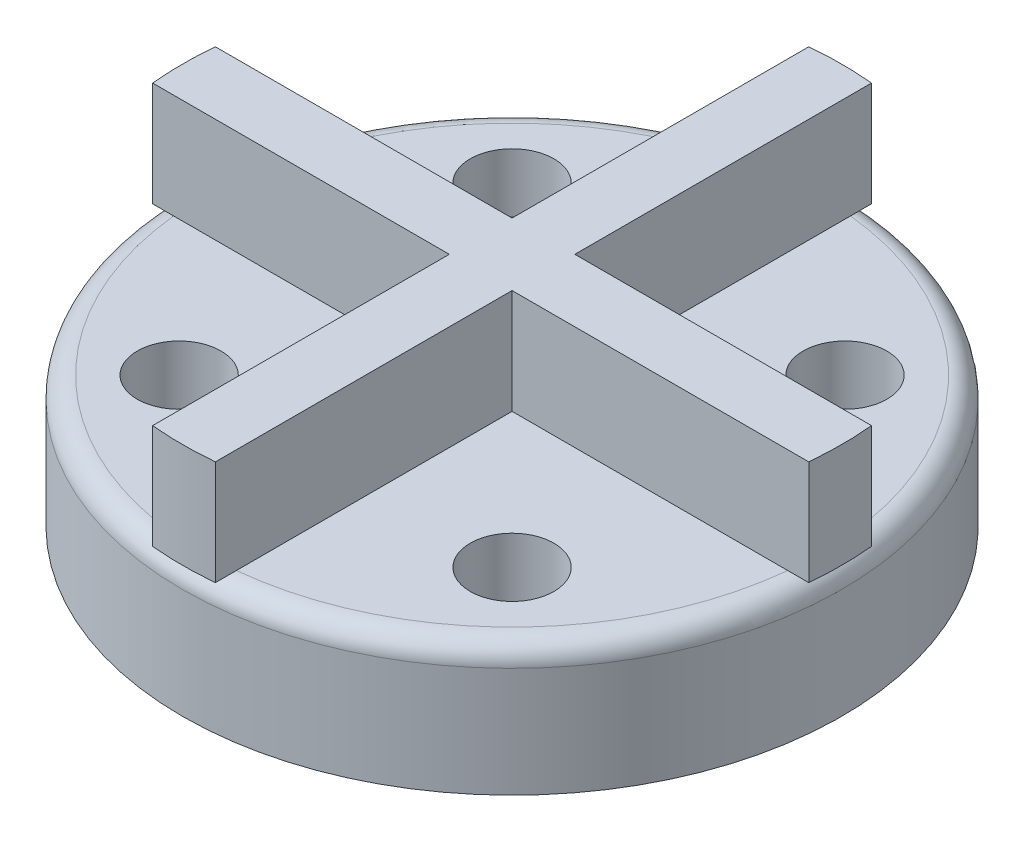
ISO-10303-21;
HEADER;
FILE_DESCRIPTION(('STEP AP214'),'2;1');
FILE_NAME('part.step','',(''),(''),'','','');
FILE_SCHEMA(('AUTOMOTIVE_DESIGN { 1 0 10303 214 1 1 1 1 }'));
ENDSEC;
DATA;
#1=APPLICATION_CONTEXT('core data for automotive mechanical design processes');
#2=APPLICATION_PROTOCOL_DEFINITION('international standard','automotive_design',2000,#1);
#3=PRODUCT_CONTEXT('',#1,'mechanical');
#4=PRODUCT('Part','Part','',(#3));
#5=PRODUCT_RELATED_PRODUCT_CATEGORY('part','',(#4));
#6=PRODUCT_DEFINITION_FORMATION('','',#4);
#7=PRODUCT_DEFINITION_CONTEXT('part definition',#1,'design');
#8=PRODUCT_DEFINITION('design','',#6,#7);
#9=PRODUCT_DEFINITION_SHAPE('','',#8);
#10=(LENGTH_UNIT() NAMED_UNIT(*) SI_UNIT(.MILLI.,.METRE.));
#11=(NAMED_UNIT(*) PLANE_ANGLE_UNIT() SI_UNIT($,.RADIAN.));
#12=(NAMED_UNIT(*) SI_UNIT($,.STERADIAN.) SOLID_ANGLE_UNIT());
#13=UNCERTAINTY_MEASURE_WITH_UNIT(LENGTH_MEASURE(1.E-05),#10,'distance_accuracy_value','');
#14=(GEOMETRIC_REPRESENTATION_CONTEXT(3) GLOBAL_UNCERTAINTY_ASSIGNED_CONTEXT((#13)) GLOBAL_UNIT_ASSIGNED_CONTEXT((#10,
#11,#12)) REPRESENTATION_CONTEXT('',''));
#15=CARTESIAN_POINT('',(0.,0.,0.));
#16=DIRECTION('',(0.,0.,1.));
#17=DIRECTION('',(1.,0.,0.));
#18=AXIS2_PLACEMENT_3D('',#15,#16,#17);
#19=CARTESIAN_POINT('',(0.,12.5,0.));
#20=DIRECTION('',(0.,1.,0.));
#21=DIRECTION('',(0.,0.,1.));
#22=AXIS2_PLACEMENT_3D('',#19,#20,#21);
#23=PLANE('',#22);
#24=CARTESIAN_POINT('',(15.9099025766973,12.5,-15.9099025766982));
#25=DIRECTION('',(0.,1.,0.));
#26=DIRECTION('',(0.,0.,1.));
#27=AXIS2_PLACEMENT_3D('',#24,#25,#26);
#28=CIRCLE('',#27,4.00000000000094);
#29=CARTESIAN_POINT('',(15.9099025766973,12.5,-11.9099025766973));
#30=VERTEX_POINT('',#29);
#31=EDGE_CURVE('E196',#30,#30,#28,.T.);
#32=ORIENTED_EDGE('',*,*,#31,.F.);
#33=EDGE_LOOP('',(#32));
#34=FACE_BOUND('',#33,.T.);
#35=DIRECTION('',(0.,0.,-1.));
#36=VECTOR('',#35,1.);
#37=CARTESIAN_POINT('',(3.00000000000011,12.5,-31.3568174405503));
#38=LINE('',#37,#36);
#39=CARTESIAN_POINT('',(3.00000000000005,12.5,-3.));
#40=VERTEX_POINT('',#39);
#41=CARTESIAN_POINT('',(3.00000000000011,12.5,-29.3470611816584));
#42=VERTEX_POINT('',#41);
#43=EDGE_CURVE('E52',#40,#42,#38,.T.);
#44=ORIENTED_EDGE('',*,*,#43,.F.);
#45=DIRECTION('',(-1.,0.,0.));
#46=VECTOR('',#45,1.);
#47=CARTESIAN_POINT('',(3.00000000000005,12.5,-3.));
#48=LINE('',#47,#46);
#49=CARTESIAN_POINT('',(29.3470611816584,12.5,-3.));
#50=VERTEX_POINT('',#49);
#51=EDGE_CURVE('E241',#50,#40,#48,.T.);
#52=ORIENTED_EDGE('',*,*,#51,.F.);
#53=CARTESIAN_POINT('',(0.,12.5,0.));
#54=DIRECTION('',(0.,1.,0.));
#55=DIRECTION('',(0.,0.,1.));
#56=AXIS2_PLACEMENT_3D('',#53,#54,#55);
#57=CIRCLE('',#56,29.5);
#58=EDGE_CURVE('E216',#50,#42,#57,.T.);
#59=ORIENTED_EDGE('',*,*,#58,.T.);
#60=EDGE_LOOP('',(#44,#52,#59));
#61=FACE_BOUND('',#60,.T.);
#62=ADVANCED_FACE('F37',(#34,#61),#23,.T.);
#63=CARTESIAN_POINT('',(-15.9099025766973,12.5,-15.9099025766973));
#64=DIRECTION('',(0.,1.,0.));
#65=DIRECTION('',(0.,0.,1.));
#66=AXIS2_PLACEMENT_3D('',#63,#64,#65);
#67=CIRCLE('',#66,4.00000000000001);
#68=CARTESIAN_POINT('',(-15.9099025766973,12.5,-11.9099025766973));
#69=VERTEX_POINT('',#68);
#70=EDGE_CURVE('E202',#69,#69,#67,.T.);
#71=ORIENTED_EDGE('',*,*,#70,.F.);
#72=EDGE_LOOP('',(#71));
#73=FACE_BOUND('',#72,.T.);
#74=DIRECTION('',(-1.,0.,0.));
#75=VECTOR('',#74,1.);
#76=CARTESIAN_POINT('',(-31.3568174405503,12.5,-3.));
#77=LINE('',#76,#75);
#78=CARTESIAN_POINT('',(-2.99999999999995,12.5,-3.));
#79=VERTEX_POINT('',#78);
#80=CARTESIAN_POINT('',(-29.3470611816584,12.5,-3.));
#81=VERTEX_POINT('',#80);
#82=EDGE_CURVE('E60',#79,#81,#77,.T.);
#83=ORIENTED_EDGE('',*,*,#82,.F.);
#84=DIRECTION('',(0.,0.,1.));
#85=VECTOR('',#84,1.);
#86=CARTESIAN_POINT('',(-2.99999999999989,12.5,-31.3568174405503));
#87=LINE('',#86,#85);
#88=CARTESIAN_POINT('',(-2.99999999999989,12.5,-29.3470611816584));
#89=VERTEX_POINT('',#88);
#90=EDGE_CURVE('E253',#89,#79,#87,.T.);
#91=ORIENTED_EDGE('',*,*,#90,.F.);
#92=EDGE_CURVE('E228',#89,#81,#57,.T.);
#93=ORIENTED_EDGE('',*,*,#92,.T.);
#94=EDGE_LOOP('',(#83,#91,#93));
#95=FACE_BOUND('',#94,.T.);
#96=ADVANCED_FACE('F348',(#73,#95),#23,.T.);
#97=CARTESIAN_POINT('',(-15.9099025766964,12.5,15.9099025766973));
#98=DIRECTION('',(0.,1.,0.));
#99=DIRECTION('',(0.,0.,1.));
#100=AXIS2_PLACEMENT_3D('',#97,#98,#99);
#101=CIRCLE('',#100,4.00000000000049);
#102=CARTESIAN_POINT('',(-15.9099025766964,12.5,19.9099025766978));
#103=VERTEX_POINT('',#102);
#104=EDGE_CURVE('E181',#103,#103,#101,.T.);
#105=ORIENTED_EDGE('',*,*,#104,.F.);
#106=EDGE_LOOP('',(#105));
#107=FACE_BOUND('',#106,.T.);
#108=DIRECTION('',(0.,0.,1.));
#109=VECTOR('',#108,1.);
#110=CARTESIAN_POINT('',(-3.00000000000006,12.5,3.));
#111=LINE('',#110,#109);
#112=CARTESIAN_POINT('',(-3.00000000000006,12.5,3.));
#113=VERTEX_POINT('',#112);
#114=CARTESIAN_POINT('',(-3.00000000000053,12.5,29.3470611816583));
#115=VERTEX_POINT('',#114);
#116=EDGE_CURVE('E268',#113,#115,#111,.T.);
#117=ORIENTED_EDGE('',*,*,#116,.F.);
#118=DIRECTION('',(1.,0.,0.));
#119=VECTOR('',#118,1.);
#120=CARTESIAN_POINT('',(-31.3568174405503,12.5,3.));
#121=LINE('',#120,#119);
#122=CARTESIAN_POINT('',(-29.3470611816584,12.5,3.));
#123=VERTEX_POINT('',#122);
#124=EDGE_CURVE('E264',#123,#113,#121,.T.);
#125=ORIENTED_EDGE('',*,*,#124,.F.);
#126=EDGE_CURVE('E218',#123,#115,#57,.T.);
#127=ORIENTED_EDGE('',*,*,#126,.T.);
#128=EDGE_LOOP('',(#117,#125,#127));
#129=FACE_BOUND('',#128,.T.);
#130=ADVANCED_FACE('F354',(#107,#129),#23,.T.);
#131=CARTESIAN_POINT('',(15.9099025766982,12.5,15.9099025766964));
#132=DIRECTION('',(0.,1.,0.));
#133=DIRECTION('',(0.,0.,1.));
#134=AXIS2_PLACEMENT_3D('',#131,#132,#133);
#135=CIRCLE('',#134,4.00000000000129);
#136=CARTESIAN_POINT('',(15.9099025766982,12.5,19.9099025766977));
#137=VERTEX_POINT('',#136);
#138=EDGE_CURVE('E190',#137,#137,#135,.T.);
#139=ORIENTED_EDGE('',*,*,#138,.F.);
#140=EDGE_LOOP('',(#139));
#141=FACE_BOUND('',#140,.T.);
#142=DIRECTION('',(1.,0.,0.));
#143=VECTOR('',#142,1.);
#144=CARTESIAN_POINT('',(2.99999999999999,12.5,3.));
#145=LINE('',#144,#143);
#146=CARTESIAN_POINT('',(2.99999999999999,12.5,3.));
#147=VERTEX_POINT('',#146);
#148=CARTESIAN_POINT('',(29.3470611816584,12.5,3.));
#149=VERTEX_POINT('',#148);
#150=EDGE_CURVE('E173',#147,#149,#145,.T.);
#151=ORIENTED_EDGE('',*,*,#150,.F.);
#152=DIRECTION('',(0.,0.,-1.));
#153=VECTOR('',#152,1.);
#154=CARTESIAN_POINT('',(2.99999999999999,12.5,3.));
#155=LINE('',#154,#153);
#156=CARTESIAN_POINT('',(2.9999999999999,12.5,29.3470611816584));
#157=VERTEX_POINT('',#156);
#158=EDGE_CURVE('E273',#157,#147,#155,.T.);
#159=ORIENTED_EDGE('',*,*,#158,.F.);
#160=EDGE_CURVE('E45',#157,#149,#57,.T.);
#161=ORIENTED_EDGE('',*,*,#160,.T.);
#162=EDGE_LOOP('',(#151,#159,#161));
#163=FACE_BOUND('',#162,.T.);
#164=ADVANCED_FACE('F329',(#141,#163),#23,.T.);
#165=CARTESIAN_POINT('',(0.,0.,0.));
#166=DIRECTION('',(0.,1.,0.));
#167=DIRECTION('',(0.,0.,1.));
#168=AXIS2_PLACEMENT_3D('',#165,#166,#167);
#169=PLANE('',#168);
#170=CARTESIAN_POINT('',(0.,0.,0.));
#171=DIRECTION('',(0.,1.,0.));
#172=DIRECTION('',(0.,0.,1.));
#173=AXIS2_PLACEMENT_3D('',#170,#171,#172);
#174=CIRCLE('',#173,31.5);
#175=CARTESIAN_POINT('',(0.,0.,31.5));
#176=VERTEX_POINT('',#175);
#177=EDGE_CURVE('E205',#176,#176,#174,.T.);
#178=ORIENTED_EDGE('',*,*,#177,.F.);
#179=EDGE_LOOP('',(#178));
#180=FACE_BOUND('',#179,.T.);
#181=CARTESIAN_POINT('',(-15.9099025766973,0.,-15.9099025766973));
#182=DIRECTION('',(0.,1.,0.));
#183=DIRECTION('',(0.,0.,1.));
#184=AXIS2_PLACEMENT_3D('',#181,#182,#183);
#185=CIRCLE('',#184,4.00000000000001);
#186=CARTESIAN_POINT('',(-15.9099025766973,0.,-11.9099025766973));
#187=VERTEX_POINT('',#186);
#188=EDGE_CURVE('E199',#187,#187,#185,.T.);
#189=ORIENTED_EDGE('',*,*,#188,.T.);
#190=EDGE_LOOP('',(#189));
#191=FACE_BOUND('',#190,.T.);
#192=CARTESIAN_POINT('',(15.9099025766973,0.,-15.9099025766982));
#193=DIRECTION('',(0.,1.,0.));
#194=DIRECTION('',(0.,0.,1.));
#195=AXIS2_PLACEMENT_3D('',#192,#193,#194);
#196=CIRCLE('',#195,4.00000000000094);
#197=CARTESIAN_POINT('',(15.9099025766973,0.,-11.9099025766973));
#198=VERTEX_POINT('',#197);
#199=EDGE_CURVE('E193',#198,#198,#196,.T.);
#200=ORIENTED_EDGE('',*,*,#199,.T.);
#201=EDGE_LOOP('',(#200));
#202=FACE_BOUND('',#201,.T.);
#203=CARTESIAN_POINT('',(15.9099025766982,0.,15.9099025766964));
#204=DIRECTION('',(0.,1.,0.));
#205=DIRECTION('',(0.,0.,1.));
#206=AXIS2_PLACEMENT_3D('',#203,#204,#205);
#207=CIRCLE('',#206,4.00000000000129);
#208=CARTESIAN_POINT('',(15.9099025766982,0.,19.9099025766977));
#209=VERTEX_POINT('',#208);
#210=EDGE_CURVE('E188',#209,#209,#207,.T.);
#211=ORIENTED_EDGE('',*,*,#210,.T.);
#212=EDGE_LOOP('',(#211));
#213=FACE_BOUND('',#212,.T.);
#214=CARTESIAN_POINT('',(-15.9099025766964,0.,15.9099025766973));
#215=DIRECTION('',(0.,1.,0.));
#216=DIRECTION('',(0.,0.,1.));
#217=AXIS2_PLACEMENT_3D('',#214,#215,#216);
#218=CIRCLE('',#217,4.00000000000049);
#219=CARTESIAN_POINT('',(-15.9099025766964,0.,19.9099025766978));
#220=VERTEX_POINT('',#219);
#221=EDGE_CURVE('E178',#220,#220,#218,.T.);
#222=ORIENTED_EDGE('',*,*,#221,.T.);
#223=EDGE_LOOP('',(#222));
#224=FACE_BOUND('',#223,.T.);
#225=ADVANCED_FACE('F360',(#180,#191,#202,#213,#224),#169,.F.);
#226=CARTESIAN_POINT('',(0.,12.5,0.));
#227=DIRECTION('',(0.,-1.,0.));
#228=DIRECTION('',(0.,0.,-1.));
#229=AXIS2_PLACEMENT_3D('',#226,#227,#228);
#230=CYLINDRICAL_SURFACE('',#229,31.5);
#231=CARTESIAN_POINT('',(0.,10.5,0.));
#232=DIRECTION('',(0.,1.,0.));
#233=DIRECTION('',(0.,0.,1.));
#234=AXIS2_PLACEMENT_3D('',#231,#232,#233);
#235=CIRCLE('',#234,31.5);
#236=CARTESIAN_POINT('',(0.,10.5,31.5));
#237=VERTEX_POINT('',#236);
#238=EDGE_CURVE('E11',#237,#237,#235,.F.);
#239=ORIENTED_EDGE('',*,*,#238,.T.);
#240=EDGE_LOOP('',(#239));
#241=FACE_BOUND('',#240,.T.);
#242=ORIENTED_EDGE('',*,*,#177,.T.);
#243=EDGE_LOOP('',(#242));
#244=FACE_BOUND('',#243,.T.);
#245=ADVANCED_FACE('F366',(#241,#244),#230,.T.);
#246=CARTESIAN_POINT('',(-15.9099025766973,12.5,-15.9099025766973));
#247=DIRECTION('',(0.,-1.,0.));
#248=DIRECTION('',(0.,0.,-1.));
#249=AXIS2_PLACEMENT_3D('',#246,#247,#248);
#250=CYLINDRICAL_SURFACE('',#249,4.00000000000001);
#251=ORIENTED_EDGE('',*,*,#70,.T.);
#252=EDGE_LOOP('',(#251));
#253=FACE_BOUND('',#252,.T.);
#254=ORIENTED_EDGE('',*,*,#188,.F.);
#255=EDGE_LOOP('',(#254));
#256=FACE_BOUND('',#255,.T.);
#257=ADVANCED_FACE('F394',(#253,#256),#250,.F.);
#258=CARTESIAN_POINT('',(15.9099025766973,12.5,-15.9099025766982));
#259=DIRECTION('',(0.,-1.,0.));
#260=DIRECTION('',(0.,0.,-1.));
#261=AXIS2_PLACEMENT_3D('',#258,#259,#260);
#262=CYLINDRICAL_SURFACE('',#261,4.00000000000094);
#263=ORIENTED_EDGE('',*,*,#31,.T.);
#264=EDGE_LOOP('',(#263));
#265=FACE_BOUND('',#264,.T.);
#266=ORIENTED_EDGE('',*,*,#199,.F.);
#267=EDGE_LOOP('',(#266));
#268=FACE_BOUND('',#267,.T.);
#269=ADVANCED_FACE('F375',(#265,#268),#262,.F.);
#270=CARTESIAN_POINT('',(15.9099025766982,12.5,15.9099025766964));
#271=DIRECTION('',(0.,-1.,0.));
#272=DIRECTION('',(0.,0.,-1.));
#273=AXIS2_PLACEMENT_3D('',#270,#271,#272);
#274=CYLINDRICAL_SURFACE('',#273,4.00000000000129);
#275=ORIENTED_EDGE('',*,*,#138,.T.);
#276=EDGE_LOOP('',(#275));
#277=FACE_BOUND('',#276,.T.);
#278=ORIENTED_EDGE('',*,*,#210,.F.);
#279=EDGE_LOOP('',(#278));
#280=FACE_BOUND('',#279,.T.);
#281=ADVANCED_FACE('F371',(#277,#280),#274,.F.);
#282=CARTESIAN_POINT('',(-15.9099025766964,12.5,15.9099025766973));
#283=DIRECTION('',(0.,-1.,0.));
#284=DIRECTION('',(0.,0.,-1.));
#285=AXIS2_PLACEMENT_3D('',#282,#283,#284);
#286=CYLINDRICAL_SURFACE('',#285,4.00000000000049);
#287=ORIENTED_EDGE('',*,*,#104,.T.);
#288=EDGE_LOOP('',(#287));
#289=FACE_BOUND('',#288,.T.);
#290=ORIENTED_EDGE('',*,*,#221,.F.);
#291=EDGE_LOOP('',(#290));
#292=FACE_BOUND('',#291,.T.);
#293=ADVANCED_FACE('F374',(#289,#292),#286,.F.);
#294=CARTESIAN_POINT('',(0.,10.5,0.));
#295=DIRECTION('',(0.,1.,0.));
#296=DIRECTION('',(0.,0.,1.));
#297=AXIS2_PLACEMENT_3D('',#294,#295,#296);
#298=TOROIDAL_SURFACE('',#297,29.5,2.);
#299=ORIENTED_EDGE('',*,*,#238,.F.);
#300=EDGE_LOOP('',(#299));
#301=FACE_BOUND('',#300,.T.);
#302=ORIENTED_EDGE('',*,*,#160,.F.);
#303=EDGE_CURVE('E209',#115,#157,#57,.T.);
#304=ORIENTED_EDGE('',*,*,#303,.F.);
#305=ORIENTED_EDGE('',*,*,#126,.F.);
#306=EDGE_CURVE('E224',#81,#123,#57,.T.);
#307=ORIENTED_EDGE('',*,*,#306,.F.);
#308=ORIENTED_EDGE('',*,*,#92,.F.);
#309=EDGE_CURVE('E233',#42,#89,#57,.T.);
#310=ORIENTED_EDGE('',*,*,#309,.F.);
#311=ORIENTED_EDGE('',*,*,#58,.F.);
#312=EDGE_CURVE('E211',#149,#50,#57,.T.);
#313=ORIENTED_EDGE('',*,*,#312,.F.);
#314=EDGE_LOOP('',(#302,#304,#305,#307,#308,#310,#311,#313));
#315=FACE_BOUND('',#314,.T.);
#316=ADVANCED_FACE('F39',(#301,#315),#298,.T.);
#317=CARTESIAN_POINT('',(0.,12.5,0.));
#318=DIRECTION('',(0.,1.,0.));
#319=DIRECTION('',(0.,0.,1.));
#320=AXIS2_PLACEMENT_3D('',#317,#318,#319);
#321=PLANE('',#320);
#322=ORIENTED_EDGE('',*,*,#306,.T.);
#323=CARTESIAN_POINT('',(-31.3568174405503,12.5,2.99999999999998));
#324=VERTEX_POINT('',#323);
#325=EDGE_CURVE('E265',#324,#123,#121,.T.);
#326=ORIENTED_EDGE('',*,*,#325,.F.);
#327=CARTESIAN_POINT('',(0.,12.5,0.));
#328=DIRECTION('',(0.,1.,0.));
#329=DIRECTION('',(0.,0.,1.));
#330=AXIS2_PLACEMENT_3D('',#327,#328,#329);
#331=CIRCLE('',#330,31.5);
#332=CARTESIAN_POINT('',(-31.3568174405503,12.5,-3.));
#333=VERTEX_POINT('',#332);
#334=EDGE_CURVE('E262',#333,#324,#331,.T.);
#335=ORIENTED_EDGE('',*,*,#334,.F.);
#336=EDGE_CURVE('E260',#81,#333,#77,.T.);
#337=ORIENTED_EDGE('',*,*,#336,.F.);
#338=EDGE_LOOP('',(#322,#326,#335,#337));
#339=FACE_BOUND('',#338,.T.);
#340=ADVANCED_FACE('F388',(#339),#321,.F.);
#341=ORIENTED_EDGE('',*,*,#309,.T.);
#342=CARTESIAN_POINT('',(-2.99999999999988,12.5,-31.3568174405503));
#343=VERTEX_POINT('',#342);
#344=EDGE_CURVE('E258',#343,#89,#87,.T.);
#345=ORIENTED_EDGE('',*,*,#344,.F.);
#346=CARTESIAN_POINT('',(0.,12.5,0.));
#347=DIRECTION('',(0.,1.,0.));
#348=DIRECTION('',(0.,0.,1.));
#349=AXIS2_PLACEMENT_3D('',#346,#347,#348);
#350=CIRCLE('',#349,31.5);
#351=CARTESIAN_POINT('',(3.00000000000011,12.5,-31.3568174405503));
#352=VERTEX_POINT('',#351);
#353=EDGE_CURVE('E246',#352,#343,#350,.T.);
#354=ORIENTED_EDGE('',*,*,#353,.F.);
#355=EDGE_CURVE('E244',#42,#352,#38,.T.);
#356=ORIENTED_EDGE('',*,*,#355,.F.);
#357=EDGE_LOOP('',(#341,#345,#354,#356));
#358=FACE_BOUND('',#357,.T.);
#359=ADVANCED_FACE('F245',(#358),#321,.F.);
#360=ORIENTED_EDGE('',*,*,#312,.T.);
#361=CARTESIAN_POINT('',(31.3568174405503,12.5,-3.));
#362=VERTEX_POINT('',#361);
#363=EDGE_CURVE('E250',#362,#50,#48,.T.);
#364=ORIENTED_EDGE('',*,*,#363,.F.);
#365=CARTESIAN_POINT('',(0.,12.5,0.));
#366=DIRECTION('',(0.,1.,0.));
#367=DIRECTION('',(0.,0.,1.));
#368=AXIS2_PLACEMENT_3D('',#365,#366,#367);
#369=CIRCLE('',#368,31.5);
#370=CARTESIAN_POINT('',(31.3568174405503,12.5,3.));
#371=VERTEX_POINT('',#370);
#372=EDGE_CURVE('E177',#371,#362,#369,.T.);
#373=ORIENTED_EDGE('',*,*,#372,.F.);
#374=EDGE_CURVE('E276',#149,#371,#145,.T.);
#375=ORIENTED_EDGE('',*,*,#374,.F.);
#376=EDGE_LOOP('',(#360,#364,#373,#375));
#377=FACE_BOUND('',#376,.T.);
#378=ADVANCED_FACE('F327',(#377),#321,.F.);
#379=CARTESIAN_POINT('',(0.,22.5,0.));
#380=DIRECTION('',(0.,-1.,0.));
#381=DIRECTION('',(0.,0.,-1.));
#382=AXIS2_PLACEMENT_3D('',#379,#380,#381);
#383=CYLINDRICAL_SURFACE('',#382,31.5);
#384=ORIENTED_EDGE('',*,*,#372,.T.);
#385=DIRECTION('',(0.,-1.,0.));
#386=VECTOR('',#385,1.);
#387=CARTESIAN_POINT('',(31.3568174405503,22.5,-3.));
#388=LINE('',#387,#386);
#389=CARTESIAN_POINT('',(31.3568174405503,22.5,-3.));
#390=VERTEX_POINT('',#389);
#391=EDGE_CURVE('E157',#390,#362,#388,.T.);
#392=ORIENTED_EDGE('',*,*,#391,.F.);
#393=CARTESIAN_POINT('',(0.,22.5,0.));
#394=DIRECTION('',(0.,1.,0.));
#395=DIRECTION('',(0.,0.,1.));
#396=AXIS2_PLACEMENT_3D('',#393,#394,#395);
#397=CIRCLE('',#396,31.5);
#398=CARTESIAN_POINT('',(31.3568174405503,22.5,3.));
#399=VERTEX_POINT('',#398);
#400=EDGE_CURVE('E164',#399,#390,#397,.T.);
#401=ORIENTED_EDGE('',*,*,#400,.F.);
#402=DIRECTION('',(0.,-1.,0.));
#403=VECTOR('',#402,1.);
#404=CARTESIAN_POINT('',(31.3568174405503,22.5,3.));
#405=LINE('',#404,#403);
#406=EDGE_CURVE('E279',#399,#371,#405,.T.);
#407=ORIENTED_EDGE('',*,*,#406,.T.);
#408=EDGE_LOOP('',(#384,#392,#401,#407));
#409=FACE_BOUND('',#408,.T.);
#410=ADVANCED_FACE('F175',(#409),#383,.T.);
#411=CARTESIAN_POINT('',(3.00000000000005,22.5,-3.));
#412=DIRECTION('',(0.,0.,1.));
#413=DIRECTION('',(1.,0.,0.));
#414=AXIS2_PLACEMENT_3D('',#411,#412,#413);
#415=PLANE('',#414);
#416=ORIENTED_EDGE('',*,*,#363,.T.);
#417=ORIENTED_EDGE('',*,*,#51,.T.);
#418=DIRECTION('',(0.,-1.,0.));
#419=VECTOR('',#418,1.);
#420=CARTESIAN_POINT('',(3.00000000000005,22.5,-3.));
#421=LINE('',#420,#419);
#422=CARTESIAN_POINT('',(3.00000000000005,22.5,-3.));
#423=VERTEX_POINT('',#422);
#424=EDGE_CURVE('E160',#423,#40,#421,.T.);
#425=ORIENTED_EDGE('',*,*,#424,.F.);
#426=DIRECTION('',(-1.,0.,0.));
#427=VECTOR('',#426,1.);
#428=CARTESIAN_POINT('',(3.00000000000005,22.5,-3.));
#429=LINE('',#428,#427);
#430=EDGE_CURVE('E152',#390,#423,#429,.T.);
#431=ORIENTED_EDGE('',*,*,#430,.F.);
#432=ORIENTED_EDGE('',*,*,#391,.T.);
#433=EDGE_LOOP('',(#416,#417,#425,#431,#432));
#434=FACE_BOUND('',#433,.T.);
#435=ADVANCED_FACE('F155',(#434),#415,.F.);
#436=CARTESIAN_POINT('',(3.00000000000011,22.5,-31.3568174405503));
#437=DIRECTION('',(-1.,0.,0.));
#438=DIRECTION('',(0.,0.,1.));
#439=AXIS2_PLACEMENT_3D('',#436,#437,#438);
#440=PLANE('',#439);
#441=ORIENTED_EDGE('',*,*,#43,.T.);
#442=ORIENTED_EDGE('',*,*,#355,.T.);
#443=DIRECTION('',(0.,-1.,0.));
#444=VECTOR('',#443,1.);
#445=CARTESIAN_POINT('',(3.00000000000011,22.5,-31.3568174405503));
#446=LINE('',#445,#444);
#447=CARTESIAN_POINT('',(3.00000000000011,22.5,-31.3568174405503));
#448=VERTEX_POINT('',#447);
#449=EDGE_CURVE('E183',#448,#352,#446,.T.);
#450=ORIENTED_EDGE('',*,*,#449,.F.);
#451=DIRECTION('',(0.,0.,-1.));
#452=VECTOR('',#451,1.);
#453=CARTESIAN_POINT('',(3.00000000000011,22.5,-31.3568174405503));
#454=LINE('',#453,#452);
#455=EDGE_CURVE('E163',#423,#448,#454,.T.);
#456=ORIENTED_EDGE('',*,*,#455,.F.);
#457=ORIENTED_EDGE('',*,*,#424,.T.);
#458=EDGE_LOOP('',(#441,#442,#450,#456,#457));
#459=FACE_BOUND('',#458,.T.);
#460=ADVANCED_FACE('F252',(#459),#440,.F.);
#461=CARTESIAN_POINT('',(0.,22.5,0.));
#462=DIRECTION('',(0.,-1.,0.));
#463=DIRECTION('',(0.,0.,-1.));
#464=AXIS2_PLACEMENT_3D('',#461,#462,#463);
#465=CYLINDRICAL_SURFACE('',#464,31.5);
#466=ORIENTED_EDGE('',*,*,#353,.T.);
#467=DIRECTION('',(0.,-1.,0.));
#468=VECTOR('',#467,1.);
#469=CARTESIAN_POINT('',(-2.99999999999988,22.5,-31.3568174405503));
#470=LINE('',#469,#468);
#471=CARTESIAN_POINT('',(-2.99999999999988,22.5,-31.3568174405503));
#472=VERTEX_POINT('',#471);
#473=EDGE_CURVE('E302',#472,#343,#470,.T.);
#474=ORIENTED_EDGE('',*,*,#473,.F.);
#475=CARTESIAN_POINT('',(0.,22.5,0.));
#476=DIRECTION('',(0.,1.,0.));
#477=DIRECTION('',(0.,0.,1.));
#478=AXIS2_PLACEMENT_3D('',#475,#476,#477);
#479=CIRCLE('',#478,31.5);
#480=EDGE_CURVE('E308',#448,#472,#479,.T.);
#481=ORIENTED_EDGE('',*,*,#480,.F.);
#482=ORIENTED_EDGE('',*,*,#449,.T.);
#483=EDGE_LOOP('',(#466,#474,#481,#482));
#484=FACE_BOUND('',#483,.T.);
#485=ADVANCED_FACE('F306',(#484),#465,.T.);
#486=CARTESIAN_POINT('',(-2.99999999999989,22.5,-31.3568174405503));
#487=DIRECTION('',(1.,0.,0.));
#488=DIRECTION('',(0.,0.,-1.));
#489=AXIS2_PLACEMENT_3D('',#486,#487,#488);
#490=PLANE('',#489);
#491=ORIENTED_EDGE('',*,*,#344,.T.);
#492=ORIENTED_EDGE('',*,*,#90,.T.);
#493=DIRECTION('',(0.,-1.,0.));
#494=VECTOR('',#493,1.);
#495=CARTESIAN_POINT('',(-2.99999999999995,22.5,-3.));
#496=LINE('',#495,#494);
#497=CARTESIAN_POINT('',(-2.99999999999995,22.5,-3.));
#498=VERTEX_POINT('',#497);
#499=EDGE_CURVE('E299',#498,#79,#496,.T.);
#500=ORIENTED_EDGE('',*,*,#499,.F.);
#501=DIRECTION('',(0.,0.,1.));
#502=VECTOR('',#501,1.);
#503=CARTESIAN_POINT('',(-2.99999999999989,22.5,-31.3568174405503));
#504=LINE('',#503,#502);
#505=EDGE_CURVE('E310',#472,#498,#504,.T.);
#506=ORIENTED_EDGE('',*,*,#505,.F.);
#507=ORIENTED_EDGE('',*,*,#473,.T.);
#508=EDGE_LOOP('',(#491,#492,#500,#506,#507));
#509=FACE_BOUND('',#508,.T.);
#510=ADVANCED_FACE('F508',(#509),#490,.F.);
#511=CARTESIAN_POINT('',(-31.3568174405503,22.5,-3.));
#512=DIRECTION('',(0.,0.,1.));
#513=DIRECTION('',(1.,0.,0.));
#514=AXIS2_PLACEMENT_3D('',#511,#512,#513);
#515=PLANE('',#514);
#516=ORIENTED_EDGE('',*,*,#82,.T.);
#517=ORIENTED_EDGE('',*,*,#336,.T.);
#518=DIRECTION('',(0.,-1.,0.));
#519=VECTOR('',#518,1.);
#520=CARTESIAN_POINT('',(-31.3568174405503,22.5,-3.));
#521=LINE('',#520,#519);
#522=CARTESIAN_POINT('',(-31.3568174405503,22.5,-3.));
#523=VERTEX_POINT('',#522);
#524=EDGE_CURVE('E296',#523,#333,#521,.T.);
#525=ORIENTED_EDGE('',*,*,#524,.F.);
#526=DIRECTION('',(-1.,0.,0.));
#527=VECTOR('',#526,1.);
#528=CARTESIAN_POINT('',(-31.3568174405503,22.5,-3.));
#529=LINE('',#528,#527);
#530=EDGE_CURVE('E314',#498,#523,#529,.T.);
#531=ORIENTED_EDGE('',*,*,#530,.F.);
#532=ORIENTED_EDGE('',*,*,#499,.T.);
#533=EDGE_LOOP('',(#516,#517,#525,#531,#532));
#534=FACE_BOUND('',#533,.T.);
#535=ADVANCED_FACE('F516',(#534),#515,.F.);
#536=CARTESIAN_POINT('',(0.,22.5,0.));
#537=DIRECTION('',(0.,-1.,0.));
#538=DIRECTION('',(0.,0.,-1.));
#539=AXIS2_PLACEMENT_3D('',#536,#537,#538);
#540=CYLINDRICAL_SURFACE('',#539,31.5);
#541=ORIENTED_EDGE('',*,*,#334,.T.);
#542=DIRECTION('',(0.,-1.,0.));
#543=VECTOR('',#542,1.);
#544=CARTESIAN_POINT('',(-31.3568174405503,22.5,2.99999999999998));
#545=LINE('',#544,#543);
#546=CARTESIAN_POINT('',(-31.3568174405503,22.5,2.99999999999998));
#547=VERTEX_POINT('',#546);
#548=EDGE_CURVE('E293',#547,#324,#545,.T.);
#549=ORIENTED_EDGE('',*,*,#548,.F.);
#550=CARTESIAN_POINT('',(0.,22.5,0.));
#551=DIRECTION('',(0.,1.,0.));
#552=DIRECTION('',(0.,0.,1.));
#553=AXIS2_PLACEMENT_3D('',#550,#551,#552);
#554=CIRCLE('',#553,31.5);
#555=EDGE_CURVE('E316',#523,#547,#554,.T.);
#556=ORIENTED_EDGE('',*,*,#555,.F.);
#557=ORIENTED_EDGE('',*,*,#524,.T.);
#558=EDGE_LOOP('',(#541,#549,#556,#557));
#559=FACE_BOUND('',#558,.T.);
#560=ADVANCED_FACE('F525',(#559),#540,.T.);
#561=CARTESIAN_POINT('',(-31.3568174405503,22.5,3.));
#562=DIRECTION('',(0.,0.,-1.));
#563=DIRECTION('',(-1.,0.,0.));
#564=AXIS2_PLACEMENT_3D('',#561,#562,#563);
#565=PLANE('',#564);
#566=ORIENTED_EDGE('',*,*,#325,.T.);
#567=ORIENTED_EDGE('',*,*,#124,.T.);
#568=DIRECTION('',(0.,-1.,0.));
#569=VECTOR('',#568,1.);
#570=CARTESIAN_POINT('',(-3.00000000000006,22.5,3.));
#571=LINE('',#570,#569);
#572=CARTESIAN_POINT('',(-3.00000000000006,22.5,3.));
#573=VERTEX_POINT('',#572);
#574=EDGE_CURVE('E290',#573,#113,#571,.T.);
#575=ORIENTED_EDGE('',*,*,#574,.F.);
#576=DIRECTION('',(1.,0.,0.));
#577=VECTOR('',#576,1.);
#578=CARTESIAN_POINT('',(-31.3568174405503,22.5,3.));
#579=LINE('',#578,#577);
#580=EDGE_CURVE('E318',#547,#573,#579,.T.);
#581=ORIENTED_EDGE('',*,*,#580,.F.);
#582=ORIENTED_EDGE('',*,*,#548,.T.);
#583=EDGE_LOOP('',(#566,#567,#575,#581,#582));
#584=FACE_BOUND('',#583,.T.);
#585=ADVANCED_FACE('F534',(#584),#565,.F.);
#586=CARTESIAN_POINT('',(-3.00000000000006,22.5,3.));
#587=DIRECTION('',(1.,0.,0.));
#588=DIRECTION('',(0.,0.,-1.));
#589=AXIS2_PLACEMENT_3D('',#586,#587,#588);
#590=PLANE('',#589);
#591=ORIENTED_EDGE('',*,*,#116,.T.);
#592=CARTESIAN_POINT('',(-3.00000000000057,12.5,31.3568174405503));
#593=VERTEX_POINT('',#592);
#594=EDGE_CURVE('E267',#115,#593,#111,.T.);
#595=ORIENTED_EDGE('',*,*,#594,.T.);
#596=DIRECTION('',(0.,-1.,0.));
#597=VECTOR('',#596,1.);
#598=CARTESIAN_POINT('',(-3.00000000000057,22.5,31.3568174405503));
#599=LINE('',#598,#597);
#600=CARTESIAN_POINT('',(-3.00000000000057,22.5,31.3568174405503));
#601=VERTEX_POINT('',#600);
#602=EDGE_CURVE('E287',#601,#593,#599,.T.);
#603=ORIENTED_EDGE('',*,*,#602,.F.);
#604=DIRECTION('',(0.,0.,1.));
#605=VECTOR('',#604,1.);
#606=CARTESIAN_POINT('',(-3.00000000000006,22.5,3.));
#607=LINE('',#606,#605);
#608=EDGE_CURVE('E320',#573,#601,#607,.T.);
#609=ORIENTED_EDGE('',*,*,#608,.F.);
#610=ORIENTED_EDGE('',*,*,#574,.T.);
#611=EDGE_LOOP('',(#591,#595,#603,#609,#610));
#612=FACE_BOUND('',#611,.T.);
#613=ADVANCED_FACE('F543',(#612),#590,.F.);
#614=CARTESIAN_POINT('',(0.,22.5,0.));
#615=DIRECTION('',(0.,-1.,0.));
#616=DIRECTION('',(0.,0.,-1.));
#617=AXIS2_PLACEMENT_3D('',#614,#615,#616);
#618=CYLINDRICAL_SURFACE('',#617,31.5);
#619=CARTESIAN_POINT('',(0.,12.5,0.));
#620=DIRECTION('',(0.,1.,0.));
#621=DIRECTION('',(0.,0.,1.));
#622=AXIS2_PLACEMENT_3D('',#619,#620,#621);
#623=CIRCLE('',#622,31.5);
#624=CARTESIAN_POINT('',(2.99999999999988,12.5,31.3568174405503));
#625=VERTEX_POINT('',#624);
#626=EDGE_CURVE('E271',#593,#625,#623,.T.);
#627=ORIENTED_EDGE('',*,*,#626,.T.);
#628=DIRECTION('',(0.,-1.,0.));
#629=VECTOR('',#628,1.);
#630=CARTESIAN_POINT('',(2.99999999999988,22.5,31.3568174405503));
#631=LINE('',#630,#629);
#632=CARTESIAN_POINT('',(2.99999999999988,22.5,31.3568174405503));
#633=VERTEX_POINT('',#632);
#634=EDGE_CURVE('E284',#633,#625,#631,.T.);
#635=ORIENTED_EDGE('',*,*,#634,.F.);
#636=CARTESIAN_POINT('',(0.,22.5,0.));
#637=DIRECTION('',(0.,1.,0.));
#638=DIRECTION('',(0.,0.,1.));
#639=AXIS2_PLACEMENT_3D('',#636,#637,#638);
#640=CIRCLE('',#639,31.5);
#641=EDGE_CURVE('E322',#601,#633,#640,.T.);
#642=ORIENTED_EDGE('',*,*,#641,.F.);
#643=ORIENTED_EDGE('',*,*,#602,.T.);
#644=EDGE_LOOP('',(#627,#635,#642,#643));
#645=FACE_BOUND('',#644,.T.);
#646=ADVANCED_FACE('F344',(#645),#618,.T.);
#647=CARTESIAN_POINT('',(2.99999999999999,22.5,3.));
#648=DIRECTION('',(-1.,0.,0.));
#649=DIRECTION('',(0.,0.,1.));
#650=AXIS2_PLACEMENT_3D('',#647,#648,#649);
#651=PLANE('',#650);
#652=EDGE_CURVE('E274',#625,#157,#155,.T.);
#653=ORIENTED_EDGE('',*,*,#652,.T.);
#654=ORIENTED_EDGE('',*,*,#158,.T.);
#655=DIRECTION('',(0.,-1.,0.));
#656=VECTOR('',#655,1.);
#657=CARTESIAN_POINT('',(2.99999999999999,22.5,3.));
#658=LINE('',#657,#656);
#659=CARTESIAN_POINT('',(2.99999999999999,22.5,3.));
#660=VERTEX_POINT('',#659);
#661=EDGE_CURVE('E281',#660,#147,#658,.T.);
#662=ORIENTED_EDGE('',*,*,#661,.F.);
#663=DIRECTION('',(0.,0.,-1.));
#664=VECTOR('',#663,1.);
#665=CARTESIAN_POINT('',(2.99999999999999,22.5,3.));
#666=LINE('',#665,#664);
#667=EDGE_CURVE('E324',#633,#660,#666,.T.);
#668=ORIENTED_EDGE('',*,*,#667,.F.);
#669=ORIENTED_EDGE('',*,*,#634,.T.);
#670=EDGE_LOOP('',(#653,#654,#662,#668,#669));
#671=FACE_BOUND('',#670,.T.);
#672=ADVANCED_FACE('F332',(#671),#651,.F.);
#673=CARTESIAN_POINT('',(2.99999999999999,22.5,3.));
#674=DIRECTION('',(0.,0.,-1.));
#675=DIRECTION('',(-1.,0.,0.));
#676=AXIS2_PLACEMENT_3D('',#673,#674,#675);
#677=PLANE('',#676);
#678=ORIENTED_EDGE('',*,*,#150,.T.);
#679=ORIENTED_EDGE('',*,*,#374,.T.);
#680=ORIENTED_EDGE('',*,*,#406,.F.);
#681=DIRECTION('',(1.,0.,0.));
#682=VECTOR('',#681,1.);
#683=CARTESIAN_POINT('',(2.99999999999999,22.5,3.));
#684=LINE('',#683,#682);
#685=EDGE_CURVE('E169',#660,#399,#684,.T.);
#686=ORIENTED_EDGE('',*,*,#685,.F.);
#687=ORIENTED_EDGE('',*,*,#661,.T.);
#688=EDGE_LOOP('',(#678,#679,#680,#686,#687));
#689=FACE_BOUND('',#688,.T.);
#690=ADVANCED_FACE('F335',(#689),#677,.F.);
#691=CARTESIAN_POINT('',(0.,22.5,0.));
#692=DIRECTION('',(0.,1.,0.));
#693=DIRECTION('',(0.,0.,1.));
#694=AXIS2_PLACEMENT_3D('',#691,#692,#693);
#695=PLANE('',#694);
#696=ORIENTED_EDGE('',*,*,#400,.T.);
#697=ORIENTED_EDGE('',*,*,#430,.T.);
#698=ORIENTED_EDGE('',*,*,#455,.T.);
#699=ORIENTED_EDGE('',*,*,#480,.T.);
#700=ORIENTED_EDGE('',*,*,#505,.T.);
#701=ORIENTED_EDGE('',*,*,#530,.T.);
#702=ORIENTED_EDGE('',*,*,#555,.T.);
#703=ORIENTED_EDGE('',*,*,#580,.T.);
#704=ORIENTED_EDGE('',*,*,#608,.T.);
#705=ORIENTED_EDGE('',*,*,#641,.T.);
#706=ORIENTED_EDGE('',*,*,#667,.T.);
#707=ORIENTED_EDGE('',*,*,#685,.T.);
#708=EDGE_LOOP('',(#696,#697,#698,#699,#700,#701,#702,#703,#704,#705,#706,#707));
#709=FACE_BOUND('',#708,.T.);
#710=ADVANCED_FACE('F167',(#709),#695,.T.);
#711=ORIENTED_EDGE('',*,*,#303,.T.);
#712=ORIENTED_EDGE('',*,*,#652,.F.);
#713=ORIENTED_EDGE('',*,*,#626,.F.);
#714=ORIENTED_EDGE('',*,*,#594,.F.);
#715=EDGE_LOOP('',(#711,#712,#713,#714));
#716=FACE_BOUND('',#715,.T.);
#717=ADVANCED_FACE('F342',(#716),#321,.F.);
#718=CLOSED_SHELL('',(#62,#96,#130,#164,#225,#245,#257,#269,#281,#293,#316,#340,#359,#378,#410,
#435,#460,#485,#510,#535,#560,#585,#613,#646,#672,#690,#710,#717));
#719=MANIFOLD_SOLID_BREP('B2',#718);
#720=ADVANCED_BREP_SHAPE_REPRESENTATION('',(#18,#719),#14);
#721=SHAPE_DEFINITION_REPRESENTATION(#9,#720);
ENDSEC;
END-ISO-10303-21;
